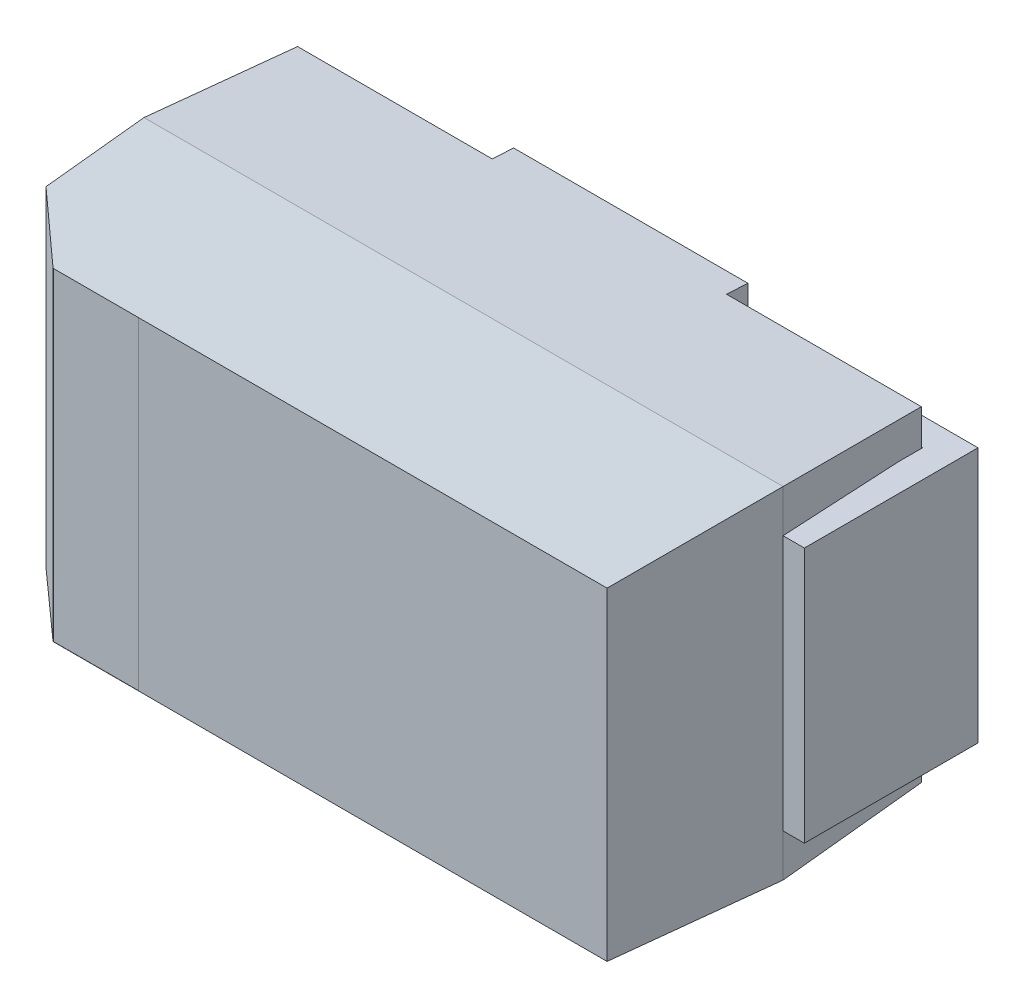
ISO-10303-21;
HEADER;
FILE_DESCRIPTION(('STEP AP214'),'2;1');
FILE_NAME('part.step','',(''),(''),'','','');
FILE_SCHEMA(('AUTOMOTIVE_DESIGN { 1 0 10303 214 1 1 1 1 }'));
ENDSEC;
DATA;
#1=APPLICATION_CONTEXT('core data for automotive mechanical design processes');
#2=APPLICATION_PROTOCOL_DEFINITION('international standard','automotive_design',2000,#1);
#3=PRODUCT_CONTEXT('',#1,'mechanical');
#4=PRODUCT('Part','Part','',(#3));
#5=PRODUCT_RELATED_PRODUCT_CATEGORY('part','',(#4));
#6=PRODUCT_DEFINITION_FORMATION('','',#4);
#7=PRODUCT_DEFINITION_CONTEXT('part definition',#1,'design');
#8=PRODUCT_DEFINITION('design','',#6,#7);
#9=PRODUCT_DEFINITION_SHAPE('','',#8);
#10=(LENGTH_UNIT() NAMED_UNIT(*) SI_UNIT(.MILLI.,.METRE.));
#11=(NAMED_UNIT(*) PLANE_ANGLE_UNIT() SI_UNIT($,.RADIAN.));
#12=(NAMED_UNIT(*) SI_UNIT($,.STERADIAN.) SOLID_ANGLE_UNIT());
#13=UNCERTAINTY_MEASURE_WITH_UNIT(LENGTH_MEASURE(1.E-05),#10,'distance_accuracy_value','');
#14=(GEOMETRIC_REPRESENTATION_CONTEXT(3) GLOBAL_UNCERTAINTY_ASSIGNED_CONTEXT((#13)) GLOBAL_UNIT_ASSIGNED_CONTEXT((#10,
#11,#12)) REPRESENTATION_CONTEXT('',''));
#15=CARTESIAN_POINT('',(0.,0.,0.));
#16=DIRECTION('',(0.,0.,1.));
#17=DIRECTION('',(1.,0.,0.));
#18=AXIS2_PLACEMENT_3D('',#15,#16,#17);
#19=CARTESIAN_POINT('',(-1.5,0.,0.815));
#20=DIRECTION('',(-0.998629534754574,0.,-0.0523359562429439));
#21=DIRECTION('',(-0.052335956242944,0.,0.998629534754574));
#22=AXIS2_PLACEMENT_3D('',#19,#20,#21);
#23=PLANE('',#22);
#24=DIRECTION('',(0.,-1.,0.));
#25=VECTOR('',#24,1.);
#26=CARTESIAN_POINT('',(-1.47,0.,0.242565899368158));
#27=LINE('',#26,#25);
#28=CARTESIAN_POINT('',(-1.47,0.6,0.242565899368157));
#29=VERTEX_POINT('',#28);
#30=CARTESIAN_POINT('',(-1.47,-0.6,0.242565899368157));
#31=VERTEX_POINT('',#30);
#32=EDGE_CURVE('E11',#29,#31,#27,.T.);
#33=ORIENTED_EDGE('',*,*,#32,.F.);
#34=DIRECTION('',(-0.052335956242944,0.,0.998629534754574));
#35=VECTOR('',#34,1.);
#36=CARTESIAN_POINT('',(-1.5,0.6,0.815));
#37=LINE('',#36,#35);
#38=CARTESIAN_POINT('',(-1.5,0.6,0.815));
#39=VERTEX_POINT('',#38);
#40=EDGE_CURVE('E317',#29,#39,#37,.T.);
#41=ORIENTED_EDGE('',*,*,#40,.T.);
#42=DIRECTION('',(0.,1.,0.));
#43=VECTOR('',#42,1.);
#44=CARTESIAN_POINT('',(-1.5,0.,0.815));
#45=LINE('',#44,#43);
#46=CARTESIAN_POINT('',(-1.5,0.8,0.815));
#47=VERTEX_POINT('',#46);
#48=EDGE_CURVE('E440',#47,#39,#45,.F.);
#49=ORIENTED_EDGE('',*,*,#48,.F.);
#50=DIRECTION('',(-0.052264427688714,0.052264427688714,0.997264688634237));
#51=VECTOR('',#50,1.);
#52=CARTESIAN_POINT('',(-1.49590264439756,0.795902644397557,0.736817797691552));
#53=LINE('',#52,#51);
#54=CARTESIAN_POINT('',(-1.46410067119112,0.764100671191117,0.13));
#55=VERTEX_POINT('',#54);
#56=EDGE_CURVE('E428',#55,#47,#53,.T.);
#57=ORIENTED_EDGE('',*,*,#56,.F.);
#58=DIRECTION('',(0.,-1.,0.));
#59=VECTOR('',#58,1.);
#60=CARTESIAN_POINT('',(-1.46410067119112,0.,0.13));
#61=LINE('',#60,#59);
#62=CARTESIAN_POINT('',(-1.46410067119112,0.6,0.13));
#63=VERTEX_POINT('',#62);
#64=EDGE_CURVE('E380',#55,#63,#61,.T.);
#65=ORIENTED_EDGE('',*,*,#64,.T.);
#66=CARTESIAN_POINT('',(-1.46410067119112,-0.6,0.13));
#67=VERTEX_POINT('',#66);
#68=EDGE_CURVE('E384',#63,#67,#61,.T.);
#69=ORIENTED_EDGE('',*,*,#68,.T.);
#70=CARTESIAN_POINT('',(-1.46410067119112,-0.764100671191117,0.13));
#71=VERTEX_POINT('',#70);
#72=EDGE_CURVE('E379',#67,#71,#61,.T.);
#73=ORIENTED_EDGE('',*,*,#72,.T.);
#74=DIRECTION('',(-0.052264427688714,-0.052264427688714,0.997264688634237));
#75=VECTOR('',#74,1.);
#76=CARTESIAN_POINT('',(-1.4978147436787,-0.797814743678697,0.773302825435494));
#77=LINE('',#76,#75);
#78=CARTESIAN_POINT('',(-1.5,-0.8,0.815));
#79=VERTEX_POINT('',#78);
#80=EDGE_CURVE('E430',#71,#79,#77,.T.);
#81=ORIENTED_EDGE('',*,*,#80,.T.);
#82=CARTESIAN_POINT('',(-1.5,-0.6,0.815));
#83=VERTEX_POINT('',#82);
#84=EDGE_CURVE('E444',#83,#79,#45,.F.);
#85=ORIENTED_EDGE('',*,*,#84,.F.);
#86=DIRECTION('',(-0.052335956242944,0.,0.998629534754574));
#87=VECTOR('',#86,1.);
#88=CARTESIAN_POINT('',(-1.5,-0.6,0.815));
#89=LINE('',#88,#87);
#90=EDGE_CURVE('E315',#31,#83,#89,.T.);
#91=ORIENTED_EDGE('',*,*,#90,.F.);
#92=EDGE_LOOP('',(#33,#41,#49,#57,#65,#69,#73,#81,#85,#91));
#93=FACE_BOUND('',#92,.T.);
#94=ADVANCED_FACE('F39',(#93),#23,.T.);
#95=CARTESIAN_POINT('',(0.,0.,0.13));
#96=DIRECTION('',(0.,0.,-1.));
#97=DIRECTION('',(1.,0.,0.));
#98=AXIS2_PLACEMENT_3D('',#95,#96,#97);
#99=PLANE('',#98);
#100=DIRECTION('',(0.,-1.,0.));
#101=VECTOR('',#100,1.);
#102=CARTESIAN_POINT('',(-0.6,0.6,0.13));
#103=LINE('',#102,#101);
#104=CARTESIAN_POINT('',(-0.6,0.6,0.13));
#105=VERTEX_POINT('',#104);
#106=CARTESIAN_POINT('',(-0.6,-0.6,0.13));
#107=VERTEX_POINT('',#106);
#108=EDGE_CURVE('E62',#105,#107,#103,.T.);
#109=ORIENTED_EDGE('',*,*,#108,.F.);
#110=DIRECTION('',(-1.,0.,0.));
#111=VECTOR('',#110,1.);
#112=CARTESIAN_POINT('',(-1.47,0.6,0.13));
#113=LINE('',#112,#111);
#114=EDGE_CURVE('E272',#105,#63,#113,.T.);
#115=ORIENTED_EDGE('',*,*,#114,.T.);
#116=ORIENTED_EDGE('',*,*,#64,.F.);
#117=DIRECTION('',(-1.,0.,0.));
#118=VECTOR('',#117,1.);
#119=CARTESIAN_POINT('',(0.,0.764100671191117,0.13));
#120=LINE('',#119,#118);
#121=CARTESIAN_POINT('',(-0.55,0.764100671191117,0.13));
#122=VERTEX_POINT('',#121);
#123=EDGE_CURVE('E474',#122,#55,#120,.T.);
#124=ORIENTED_EDGE('',*,*,#123,.F.);
#125=DIRECTION('',(0.,1.,0.));
#126=VECTOR('',#125,1.);
#127=CARTESIAN_POINT('',(-0.55,0.834389467592597,0.13));
#128=LINE('',#127,#126);
#129=CARTESIAN_POINT('',(-0.55,-0.764100671191117,0.13));
#130=VERTEX_POINT('',#129);
#131=EDGE_CURVE('E370',#130,#122,#128,.T.);
#132=ORIENTED_EDGE('',*,*,#131,.F.);
#133=DIRECTION('',(1.,0.,0.));
#134=VECTOR('',#133,1.);
#135=CARTESIAN_POINT('',(0.,-0.764100671191117,0.13));
#136=LINE('',#135,#134);
#137=EDGE_CURVE('E383',#71,#130,#136,.T.);
#138=ORIENTED_EDGE('',*,*,#137,.F.);
#139=ORIENTED_EDGE('',*,*,#72,.F.);
#140=DIRECTION('',(-1.,0.,0.));
#141=VECTOR('',#140,1.);
#142=CARTESIAN_POINT('',(-1.47,-0.6,0.13));
#143=LINE('',#142,#141);
#144=EDGE_CURVE('E290',#107,#67,#143,.T.);
#145=ORIENTED_EDGE('',*,*,#144,.F.);
#146=EDGE_LOOP('',(#109,#115,#116,#124,#132,#138,#139,#145));
#147=FACE_BOUND('',#146,.T.);
#148=ADVANCED_FACE('F561',(#147),#99,.T.);
#149=CARTESIAN_POINT('',(1.5,0.,0.815));
#150=DIRECTION('',(0.998629534754574,0.,-0.0523359562429439));
#151=DIRECTION('',(-0.052335956242944,0.,-0.998629534754574));
#152=AXIS2_PLACEMENT_3D('',#149,#150,#151);
#153=PLANE('',#152);
#154=DIRECTION('',(0.,-1.,0.));
#155=VECTOR('',#154,1.);
#156=CARTESIAN_POINT('',(1.5,0.,0.815));
#157=LINE('',#156,#155);
#158=CARTESIAN_POINT('',(1.5,0.6,0.815));
#159=VERTEX_POINT('',#158);
#160=CARTESIAN_POINT('',(1.5,0.8,0.815));
#161=VERTEX_POINT('',#160);
#162=EDGE_CURVE('E439',#159,#161,#157,.F.);
#163=ORIENTED_EDGE('',*,*,#162,.F.);
#164=DIRECTION('',(-0.052335956242944,0.,-0.998629534754574));
#165=VECTOR('',#164,1.);
#166=CARTESIAN_POINT('',(1.5,0.6,0.815));
#167=LINE('',#166,#165);
#168=CARTESIAN_POINT('',(1.47,0.6,0.242565899368157));
#169=VERTEX_POINT('',#168);
#170=EDGE_CURVE('E367',#159,#169,#167,.T.);
#171=ORIENTED_EDGE('',*,*,#170,.T.);
#172=DIRECTION('',(0.,-1.,0.));
#173=VECTOR('',#172,1.);
#174=CARTESIAN_POINT('',(1.47,0.,0.242565899368158));
#175=LINE('',#174,#173);
#176=CARTESIAN_POINT('',(1.47,-0.6,0.242565899368157));
#177=VERTEX_POINT('',#176);
#178=EDGE_CURVE('E47',#169,#177,#175,.T.);
#179=ORIENTED_EDGE('',*,*,#178,.T.);
#180=DIRECTION('',(-0.052335956242944,0.,-0.998629534754574));
#181=VECTOR('',#180,1.);
#182=CARTESIAN_POINT('',(1.5,-0.6,0.815));
#183=LINE('',#182,#181);
#184=CARTESIAN_POINT('',(1.5,-0.6,0.815));
#185=VERTEX_POINT('',#184);
#186=EDGE_CURVE('E365',#185,#177,#183,.T.);
#187=ORIENTED_EDGE('',*,*,#186,.F.);
#188=CARTESIAN_POINT('',(1.5,-0.8,0.815));
#189=VERTEX_POINT('',#188);
#190=EDGE_CURVE('E447',#189,#185,#157,.F.);
#191=ORIENTED_EDGE('',*,*,#190,.F.);
#192=DIRECTION('',(0.052264427688714,-0.052264427688714,0.997264688634237));
#193=VECTOR('',#192,1.);
#194=CARTESIAN_POINT('',(1.49590264439756,-0.795902644397557,0.736817797691552));
#195=LINE('',#194,#193);
#196=CARTESIAN_POINT('',(1.46410067119112,-0.764100671191117,0.13));
#197=VERTEX_POINT('',#196);
#198=EDGE_CURVE('E434',#197,#189,#195,.T.);
#199=ORIENTED_EDGE('',*,*,#198,.F.);
#200=DIRECTION('',(0.,1.,0.));
#201=VECTOR('',#200,1.);
#202=CARTESIAN_POINT('',(1.46410067119112,0.,0.13));
#203=LINE('',#202,#201);
#204=CARTESIAN_POINT('',(1.46410067119112,-0.6,0.13));
#205=VERTEX_POINT('',#204);
#206=EDGE_CURVE('E396',#197,#205,#203,.T.);
#207=ORIENTED_EDGE('',*,*,#206,.T.);
#208=CARTESIAN_POINT('',(1.46410067119112,0.6,0.13));
#209=VERTEX_POINT('',#208);
#210=EDGE_CURVE('E400',#205,#209,#203,.T.);
#211=ORIENTED_EDGE('',*,*,#210,.T.);
#212=CARTESIAN_POINT('',(1.46410067119112,0.764100671191117,0.13));
#213=VERTEX_POINT('',#212);
#214=EDGE_CURVE('E395',#209,#213,#203,.T.);
#215=ORIENTED_EDGE('',*,*,#214,.T.);
#216=DIRECTION('',(0.052264427688714,0.052264427688714,0.997264688634237));
#217=VECTOR('',#216,1.);
#218=CARTESIAN_POINT('',(1.4978147436787,0.797814743678697,0.773302825435494));
#219=LINE('',#218,#217);
#220=EDGE_CURVE('E431',#213,#161,#219,.T.);
#221=ORIENTED_EDGE('',*,*,#220,.T.);
#222=EDGE_LOOP('',(#163,#171,#179,#187,#191,#199,#207,#211,#215,#221));
#223=FACE_BOUND('',#222,.T.);
#224=ADVANCED_FACE('F480',(#223),#153,.T.);
#225=CARTESIAN_POINT('',(0.,0.,0.13));
#226=DIRECTION('',(0.,0.,-1.));
#227=DIRECTION('',(-1.,0.,0.));
#228=AXIS2_PLACEMENT_3D('',#225,#226,#227);
#229=PLANE('',#228);
#230=ORIENTED_EDGE('',*,*,#214,.F.);
#231=DIRECTION('',(1.,0.,0.));
#232=VECTOR('',#231,1.);
#233=CARTESIAN_POINT('',(1.47,0.6,0.13));
#234=LINE('',#233,#232);
#235=CARTESIAN_POINT('',(0.6,0.6,0.13));
#236=VERTEX_POINT('',#235);
#237=EDGE_CURVE('E321',#236,#209,#234,.T.);
#238=ORIENTED_EDGE('',*,*,#237,.F.);
#239=DIRECTION('',(0.,-1.,0.));
#240=VECTOR('',#239,1.);
#241=CARTESIAN_POINT('',(0.6,0.6,0.13));
#242=LINE('',#241,#240);
#243=CARTESIAN_POINT('',(0.6,-0.6,0.13));
#244=VERTEX_POINT('',#243);
#245=EDGE_CURVE('E337',#236,#244,#242,.T.);
#246=ORIENTED_EDGE('',*,*,#245,.T.);
#247=DIRECTION('',(1.,0.,0.));
#248=VECTOR('',#247,1.);
#249=CARTESIAN_POINT('',(1.47,-0.6,0.13));
#250=LINE('',#249,#248);
#251=EDGE_CURVE('E338',#244,#205,#250,.T.);
#252=ORIENTED_EDGE('',*,*,#251,.T.);
#253=ORIENTED_EDGE('',*,*,#206,.F.);
#254=DIRECTION('',(1.,0.,0.));
#255=VECTOR('',#254,1.);
#256=CARTESIAN_POINT('',(0.,-0.764100671191117,0.13));
#257=LINE('',#256,#255);
#258=CARTESIAN_POINT('',(0.55,-0.764100671191117,0.13));
#259=VERTEX_POINT('',#258);
#260=EDGE_CURVE('E399',#259,#197,#257,.T.);
#261=ORIENTED_EDGE('',*,*,#260,.F.);
#262=DIRECTION('',(0.,1.,0.));
#263=VECTOR('',#262,1.);
#264=CARTESIAN_POINT('',(0.55,0.834389467592597,0.13));
#265=LINE('',#264,#263);
#266=CARTESIAN_POINT('',(0.55,0.764100671191117,0.13));
#267=VERTEX_POINT('',#266);
#268=EDGE_CURVE('E387',#259,#267,#265,.T.);
#269=ORIENTED_EDGE('',*,*,#268,.T.);
#270=DIRECTION('',(-1.,0.,0.));
#271=VECTOR('',#270,1.);
#272=CARTESIAN_POINT('',(0.,0.764100671191117,0.13));
#273=LINE('',#272,#271);
#274=EDGE_CURVE('E468',#213,#267,#273,.T.);
#275=ORIENTED_EDGE('',*,*,#274,.F.);
#276=EDGE_LOOP('',(#230,#238,#246,#252,#253,#261,#269,#275));
#277=FACE_BOUND('',#276,.T.);
#278=ADVANCED_FACE('F520',(#277),#229,.T.);
#279=CARTESIAN_POINT('',(0.,-0.8,0.815));
#280=DIRECTION('',(0.,-0.998629534754574,-0.0523359562429439));
#281=DIRECTION('',(0.,0.052335956242944,-0.998629534754574));
#282=AXIS2_PLACEMENT_3D('',#279,#280,#281);
#283=PLANE('',#282);
#284=ORIENTED_EDGE('',*,*,#137,.T.);
#285=DIRECTION('',(0.,0.052335956242944,-0.998629534754574));
#286=VECTOR('',#285,1.);
#287=CARTESIAN_POINT('',(-0.55,-0.8,0.815));
#288=LINE('',#287,#286);
#289=CARTESIAN_POINT('',(-0.55,-0.758859893262813,0.03));
#290=VERTEX_POINT('',#289);
#291=EDGE_CURVE('E376',#130,#290,#288,.T.);
#292=ORIENTED_EDGE('',*,*,#291,.T.);
#293=DIRECTION('',(1.,0.,0.));
#294=VECTOR('',#293,1.);
#295=CARTESIAN_POINT('',(0.,-0.758859893262813,0.03));
#296=LINE('',#295,#294);
#297=CARTESIAN_POINT('',(0.55,-0.758859893262813,0.03));
#298=VERTEX_POINT('',#297);
#299=EDGE_CURVE('E403',#290,#298,#296,.T.);
#300=ORIENTED_EDGE('',*,*,#299,.T.);
#301=DIRECTION('',(0.,0.052335956242944,-0.998629534754574));
#302=VECTOR('',#301,1.);
#303=CARTESIAN_POINT('',(0.55,-0.8,0.815));
#304=LINE('',#303,#302);
#305=EDGE_CURVE('E392',#259,#298,#304,.T.);
#306=ORIENTED_EDGE('',*,*,#305,.F.);
#307=ORIENTED_EDGE('',*,*,#260,.T.);
#308=ORIENTED_EDGE('',*,*,#198,.T.);
#309=DIRECTION('',(-1.,0.,0.));
#310=VECTOR('',#309,1.);
#311=CARTESIAN_POINT('',(0.,-0.8,0.815));
#312=LINE('',#311,#310);
#313=EDGE_CURVE('E425',#79,#189,#312,.F.);
#314=ORIENTED_EDGE('',*,*,#313,.F.);
#315=ORIENTED_EDGE('',*,*,#80,.F.);
#316=EDGE_LOOP('',(#284,#292,#300,#306,#307,#308,#314,#315));
#317=FACE_BOUND('',#316,.T.);
#318=ADVANCED_FACE('F527',(#317),#283,.T.);
#319=CARTESIAN_POINT('',(0.,0.8,0.815));
#320=DIRECTION('',(0.,0.998629534754574,-0.0523359562429439));
#321=DIRECTION('',(0.,0.052335956242944,0.998629534754574));
#322=AXIS2_PLACEMENT_3D('',#319,#320,#321);
#323=PLANE('',#322);
#324=DIRECTION('',(-1.,0.,0.));
#325=VECTOR('',#324,1.);
#326=CARTESIAN_POINT('',(0.,0.758859893262813,0.03));
#327=LINE('',#326,#325);
#328=CARTESIAN_POINT('',(0.55,0.758859893262813,0.03));
#329=VERTEX_POINT('',#328);
#330=CARTESIAN_POINT('',(-0.55,0.758859893262813,0.03));
#331=VERTEX_POINT('',#330);
#332=EDGE_CURVE('E437',#329,#331,#327,.T.);
#333=ORIENTED_EDGE('',*,*,#332,.T.);
#334=DIRECTION('',(0.,0.052335956242944,0.998629534754574));
#335=VECTOR('',#334,1.);
#336=CARTESIAN_POINT('',(-0.55,0.8,0.815));
#337=LINE('',#336,#335);
#338=EDGE_CURVE('E373',#331,#122,#337,.T.);
#339=ORIENTED_EDGE('',*,*,#338,.T.);
#340=ORIENTED_EDGE('',*,*,#123,.T.);
#341=ORIENTED_EDGE('',*,*,#56,.T.);
#342=DIRECTION('',(1.,0.,0.));
#343=VECTOR('',#342,1.);
#344=CARTESIAN_POINT('',(0.,0.8,0.815));
#345=LINE('',#344,#343);
#346=EDGE_CURVE('E450',#161,#47,#345,.F.);
#347=ORIENTED_EDGE('',*,*,#346,.F.);
#348=ORIENTED_EDGE('',*,*,#220,.F.);
#349=ORIENTED_EDGE('',*,*,#274,.T.);
#350=DIRECTION('',(0.,0.052335956242944,0.998629534754574));
#351=VECTOR('',#350,1.);
#352=CARTESIAN_POINT('',(0.55,0.8,0.815));
#353=LINE('',#352,#351);
#354=EDGE_CURVE('E390',#329,#267,#353,.T.);
#355=ORIENTED_EDGE('',*,*,#354,.F.);
#356=EDGE_LOOP('',(#333,#339,#340,#341,#347,#348,#349,#355));
#357=FACE_BOUND('',#356,.T.);
#358=ADVANCED_FACE('F538',(#357),#323,.T.);
#359=CARTESIAN_POINT('',(0.,0.,0.03));
#360=DIRECTION('',(0.,0.,-1.));
#361=DIRECTION('',(1.,0.,0.));
#362=AXIS2_PLACEMENT_3D('',#359,#360,#361);
#363=PLANE('',#362);
#364=ORIENTED_EDGE('',*,*,#299,.F.);
#365=DIRECTION('',(0.,1.,0.));
#366=VECTOR('',#365,1.);
#367=CARTESIAN_POINT('',(-0.55,0.,0.03));
#368=LINE('',#367,#366);
#369=EDGE_CURVE('E471',#290,#331,#368,.T.);
#370=ORIENTED_EDGE('',*,*,#369,.T.);
#371=ORIENTED_EDGE('',*,*,#332,.F.);
#372=DIRECTION('',(0.,1.,0.));
#373=VECTOR('',#372,1.);
#374=CARTESIAN_POINT('',(0.55,0.,0.03));
#375=LINE('',#374,#373);
#376=EDGE_CURVE('E466',#298,#329,#375,.T.);
#377=ORIENTED_EDGE('',*,*,#376,.F.);
#378=EDGE_LOOP('',(#364,#370,#371,#377));
#379=FACE_BOUND('',#378,.T.);
#380=ADVANCED_FACE('F536',(#379),#363,.T.);
#381=CARTESIAN_POINT('',(1.5,0.,0.815));
#382=DIRECTION('',(0.998629534754574,0.,0.0523359562429439));
#383=DIRECTION('',(0.052335956242944,0.,-0.998629534754574));
#384=AXIS2_PLACEMENT_3D('',#381,#382,#383);
#385=PLANE('',#384);
#386=ORIENTED_EDGE('',*,*,#190,.T.);
#387=EDGE_CURVE('E451',#185,#159,#157,.F.);
#388=ORIENTED_EDGE('',*,*,#387,.T.);
#389=ORIENTED_EDGE('',*,*,#162,.T.);
#390=DIRECTION('',(0.052264427688714,0.052264427688714,-0.997264688634237));
#391=VECTOR('',#390,1.);
#392=CARTESIAN_POINT('',(1.49590264439756,0.795902644397557,0.893182202308448));
#393=LINE('',#392,#391);
#394=CARTESIAN_POINT('',(1.45885989326281,0.758859893262813,1.6));
#395=VERTEX_POINT('',#394);
#396=EDGE_CURVE('E411',#395,#161,#393,.T.);
#397=ORIENTED_EDGE('',*,*,#396,.F.);
#398=DIRECTION('',(0.,-1.,0.));
#399=VECTOR('',#398,1.);
#400=CARTESIAN_POINT('',(1.45885989326281,0.,1.6));
#401=LINE('',#400,#399);
#402=CARTESIAN_POINT('',(1.45885989326281,-0.758859893262813,1.6));
#403=VERTEX_POINT('',#402);
#404=EDGE_CURVE('E421',#403,#395,#401,.F.);
#405=ORIENTED_EDGE('',*,*,#404,.F.);
#406=DIRECTION('',(0.052264427688714,-0.052264427688714,-0.997264688634237));
#407=VECTOR('',#406,1.);
#408=CARTESIAN_POINT('',(1.4978147436787,-0.797814743678697,0.856697174564506));
#409=LINE('',#408,#407);
#410=EDGE_CURVE('E408',#403,#189,#409,.T.);
#411=ORIENTED_EDGE('',*,*,#410,.T.);
#412=EDGE_LOOP('',(#386,#388,#389,#397,#405,#411));
#413=FACE_BOUND('',#412,.T.);
#414=ADVANCED_FACE('F542',(#413),#385,.T.);
#415=CARTESIAN_POINT('',(0.,0.8,0.815));
#416=DIRECTION('',(0.,0.998629534754574,0.0523359562429439));
#417=DIRECTION('',(0.,-0.052335956242944,0.998629534754574));
#418=AXIS2_PLACEMENT_3D('',#415,#416,#417);
#419=PLANE('',#418);
#420=DIRECTION('',(-0.052264427688714,0.052264427688714,-0.997264688634237));
#421=VECTOR('',#420,1.);
#422=CARTESIAN_POINT('',(-1.4978147436787,0.797814743678697,0.856697174564506));
#423=LINE('',#422,#421);
#424=CARTESIAN_POINT('',(-1.4745606801357,0.774560680135696,1.30041113957363));
#425=VERTEX_POINT('',#424);
#426=EDGE_CURVE('E407',#425,#47,#423,.T.);
#427=ORIENTED_EDGE('',*,*,#426,.F.);
#428=DIRECTION('',(0.742688309017099,-0.0350461069503161,0.668719557091722));
#429=VECTOR('',#428,1.);
#430=CARTESIAN_POINT('',(-1.12208168375109,0.757927839070265,1.61778465344837));
#431=LINE('',#430,#429);
#432=CARTESIAN_POINT('',(-1.14183354244275,0.758859893262813,1.6));
#433=VERTEX_POINT('',#432);
#434=EDGE_CURVE('E463',#425,#433,#431,.T.);
#435=ORIENTED_EDGE('',*,*,#434,.T.);
#436=DIRECTION('',(-1.,0.,0.));
#437=VECTOR('',#436,1.);
#438=CARTESIAN_POINT('',(-0.741833542442751,0.758859893262813,1.6));
#439=LINE('',#438,#437);
#440=CARTESIAN_POINT('',(-0.741833542442751,0.758859893262813,1.6));
#441=VERTEX_POINT('',#440);
#442=EDGE_CURVE('E259',#441,#433,#439,.T.);
#443=ORIENTED_EDGE('',*,*,#442,.F.);
#444=DIRECTION('',(1.,0.,0.));
#445=VECTOR('',#444,1.);
#446=CARTESIAN_POINT('',(0.,0.758859893262813,1.6));
#447=LINE('',#446,#445);
#448=EDGE_CURVE('E424',#395,#441,#447,.F.);
#449=ORIENTED_EDGE('',*,*,#448,.F.);
#450=ORIENTED_EDGE('',*,*,#396,.T.);
#451=ORIENTED_EDGE('',*,*,#346,.T.);
#452=EDGE_LOOP('',(#427,#435,#443,#449,#450,#451));
#453=FACE_BOUND('',#452,.T.);
#454=ADVANCED_FACE('F601',(#453),#419,.T.);
#455=CARTESIAN_POINT('',(-1.5,0.,0.815));
#456=DIRECTION('',(-0.998629534754574,0.,0.0523359562429439));
#457=DIRECTION('',(0.052335956242944,0.,0.998629534754574));
#458=AXIS2_PLACEMENT_3D('',#455,#456,#457);
#459=PLANE('',#458);
#460=DIRECTION('',(-0.052264427688714,-0.052264427688714,-0.997264688634237));
#461=VECTOR('',#460,1.);
#462=CARTESIAN_POINT('',(-1.49590264439756,-0.795902644397557,0.893182202308448));
#463=LINE('',#462,#461);
#464=CARTESIAN_POINT('',(-1.4745606801357,-0.774560680135696,1.30041113957363));
#465=VERTEX_POINT('',#464);
#466=EDGE_CURVE('E404',#465,#79,#463,.T.);
#467=ORIENTED_EDGE('',*,*,#466,.F.);
#468=DIRECTION('',(0.,-1.,0.));
#469=VECTOR('',#468,1.);
#470=CARTESIAN_POINT('',(-1.4745606801357,0.758859893262813,1.30041113957363));
#471=LINE('',#470,#469);
#472=EDGE_CURVE('E461',#465,#425,#471,.F.);
#473=ORIENTED_EDGE('',*,*,#472,.T.);
#474=ORIENTED_EDGE('',*,*,#426,.T.);
#475=ORIENTED_EDGE('',*,*,#48,.T.);
#476=EDGE_CURVE('E443',#39,#83,#45,.F.);
#477=ORIENTED_EDGE('',*,*,#476,.T.);
#478=ORIENTED_EDGE('',*,*,#84,.T.);
#479=EDGE_LOOP('',(#467,#473,#474,#475,#477,#478));
#480=FACE_BOUND('',#479,.T.);
#481=ADVANCED_FACE('F598',(#480),#459,.T.);
#482=CARTESIAN_POINT('',(0.,-0.8,0.815));
#483=DIRECTION('',(0.,-0.998629534754574,0.0523359562429439));
#484=DIRECTION('',(0.,-0.052335956242944,-0.998629534754574));
#485=AXIS2_PLACEMENT_3D('',#482,#483,#484);
#486=PLANE('',#485);
#487=DIRECTION('',(-1.,0.,0.));
#488=VECTOR('',#487,1.);
#489=CARTESIAN_POINT('',(0.,-0.758859893262813,1.6));
#490=LINE('',#489,#488);
#491=CARTESIAN_POINT('',(-1.14183354244275,-0.758859893262813,1.6));
#492=VERTEX_POINT('',#491);
#493=CARTESIAN_POINT('',(-0.74183354244275,-0.758859893262813,1.6));
#494=VERTEX_POINT('',#493);
#495=EDGE_CURVE('E417',#492,#494,#490,.F.);
#496=ORIENTED_EDGE('',*,*,#495,.F.);
#497=DIRECTION('',(-0.742688309017099,-0.0350461069503161,-0.668719557091722));
#498=VECTOR('',#497,1.);
#499=CARTESIAN_POINT('',(-1.12208168375109,-0.757927839070265,1.61778465344837));
#500=LINE('',#499,#498);
#501=EDGE_CURVE('E459',#492,#465,#500,.T.);
#502=ORIENTED_EDGE('',*,*,#501,.T.);
#503=ORIENTED_EDGE('',*,*,#466,.T.);
#504=ORIENTED_EDGE('',*,*,#313,.T.);
#505=ORIENTED_EDGE('',*,*,#410,.F.);
#506=EDGE_CURVE('E420',#494,#403,#490,.F.);
#507=ORIENTED_EDGE('',*,*,#506,.F.);
#508=EDGE_LOOP('',(#496,#502,#503,#504,#505,#507));
#509=FACE_BOUND('',#508,.T.);
#510=ADVANCED_FACE('F547',(#509),#486,.T.);
#511=CARTESIAN_POINT('',(0.,0.,1.6));
#512=DIRECTION('',(0.,0.,1.));
#513=DIRECTION('',(1.,0.,0.));
#514=AXIS2_PLACEMENT_3D('',#511,#512,#513);
#515=PLANE('',#514);
#516=DIRECTION('',(0.,1.,0.));
#517=VECTOR('',#516,1.);
#518=CARTESIAN_POINT('',(-0.741833542442751,0.758859893262813,1.6));
#519=LINE('',#518,#517);
#520=EDGE_CURVE('E242',#494,#441,#519,.T.);
#521=ORIENTED_EDGE('',*,*,#520,.F.);
#522=ORIENTED_EDGE('',*,*,#506,.T.);
#523=ORIENTED_EDGE('',*,*,#404,.T.);
#524=ORIENTED_EDGE('',*,*,#448,.T.);
#525=EDGE_LOOP('',(#521,#522,#523,#524));
#526=FACE_BOUND('',#525,.T.);
#527=ADVANCED_FACE('F594',(#526),#515,.T.);
#528=CARTESIAN_POINT('',(-1.14183354244275,0.,1.6));
#529=DIRECTION('',(0.669130606358859,0.,-0.743144825477393));
#530=DIRECTION('',(0.,-1.,0.));
#531=AXIS2_PLACEMENT_3D('',#528,#529,#530);
#532=PLANE('',#531);
#533=ORIENTED_EDGE('',*,*,#434,.F.);
#534=ORIENTED_EDGE('',*,*,#472,.F.);
#535=ORIENTED_EDGE('',*,*,#501,.F.);
#536=DIRECTION('',(0.,-1.,0.));
#537=VECTOR('',#536,1.);
#538=CARTESIAN_POINT('',(-1.14183354244275,-0.758859893262813,1.6));
#539=LINE('',#538,#537);
#540=EDGE_CURVE('E414',#433,#492,#539,.T.);
#541=ORIENTED_EDGE('',*,*,#540,.F.);
#542=EDGE_LOOP('',(#533,#534,#535,#541));
#543=FACE_BOUND('',#542,.T.);
#544=ADVANCED_FACE('F41',(#543),#532,.F.);
#545=CARTESIAN_POINT('',(0.55,0.834389467592597,0.13));
#546=DIRECTION('',(-1.,0.,0.));
#547=DIRECTION('',(0.,-1.,0.));
#548=AXIS2_PLACEMENT_3D('',#545,#546,#547);
#549=PLANE('',#548);
#550=ORIENTED_EDGE('',*,*,#305,.T.);
#551=ORIENTED_EDGE('',*,*,#376,.T.);
#552=ORIENTED_EDGE('',*,*,#354,.T.);
#553=ORIENTED_EDGE('',*,*,#268,.F.);
#554=EDGE_LOOP('',(#550,#551,#552,#553));
#555=FACE_BOUND('',#554,.T.);
#556=ADVANCED_FACE('F532',(#555),#549,.F.);
#557=CARTESIAN_POINT('',(-0.55,0.834389467592597,0.13));
#558=DIRECTION('',(-1.,0.,0.));
#559=DIRECTION('',(0.,-1.,0.));
#560=AXIS2_PLACEMENT_3D('',#557,#558,#559);
#561=PLANE('',#560);
#562=ORIENTED_EDGE('',*,*,#131,.T.);
#563=ORIENTED_EDGE('',*,*,#338,.F.);
#564=ORIENTED_EDGE('',*,*,#369,.F.);
#565=ORIENTED_EDGE('',*,*,#291,.F.);
#566=EDGE_LOOP('',(#562,#563,#564,#565));
#567=FACE_BOUND('',#566,.T.);
#568=ADVANCED_FACE('F563',(#567),#561,.T.);
#569=CARTESIAN_POINT('',(1.6,0.6,0.815));
#570=DIRECTION('',(0.,0.,-1.));
#571=DIRECTION('',(-1.,0.,0.));
#572=AXIS2_PLACEMENT_3D('',#569,#570,#571);
#573=PLANE('',#572);
#574=DIRECTION('',(1.,0.,0.));
#575=VECTOR('',#574,1.);
#576=CARTESIAN_POINT('',(1.6,0.6,0.815));
#577=LINE('',#576,#575);
#578=CARTESIAN_POINT('',(1.6,0.6,0.815));
#579=VERTEX_POINT('',#578);
#580=EDGE_CURVE('E328',#159,#579,#577,.T.);
#581=ORIENTED_EDGE('',*,*,#580,.F.);
#582=ORIENTED_EDGE('',*,*,#387,.F.);
#583=DIRECTION('',(1.,0.,0.));
#584=VECTOR('',#583,1.);
#585=CARTESIAN_POINT('',(1.6,-0.6,0.815));
#586=LINE('',#585,#584);
#587=CARTESIAN_POINT('',(1.6,-0.6,0.815));
#588=VERTEX_POINT('',#587);
#589=EDGE_CURVE('E343',#185,#588,#586,.T.);
#590=ORIENTED_EDGE('',*,*,#589,.T.);
#591=DIRECTION('',(0.,-1.,0.));
#592=VECTOR('',#591,1.);
#593=CARTESIAN_POINT('',(1.6,0.6,0.815));
#594=LINE('',#593,#592);
#595=EDGE_CURVE('E359',#579,#588,#594,.T.);
#596=ORIENTED_EDGE('',*,*,#595,.F.);
#597=EDGE_LOOP('',(#581,#582,#590,#596));
#598=FACE_BOUND('',#597,.T.);
#599=ADVANCED_FACE('F504',(#598),#573,.F.);
#600=CARTESIAN_POINT('',(1.47,0.6,0.13));
#601=DIRECTION('',(0.,0.,-1.));
#602=DIRECTION('',(-1.,0.,0.));
#603=AXIS2_PLACEMENT_3D('',#600,#601,#602);
#604=PLANE('',#603);
#605=ORIENTED_EDGE('',*,*,#210,.F.);
#606=CARTESIAN_POINT('',(1.47,-0.6,0.13));
#607=VERTEX_POINT('',#606);
#608=EDGE_CURVE('E320',#205,#607,#250,.T.);
#609=ORIENTED_EDGE('',*,*,#608,.T.);
#610=DIRECTION('',(0.,-1.,0.));
#611=VECTOR('',#610,1.);
#612=CARTESIAN_POINT('',(1.47,0.6,0.13));
#613=LINE('',#612,#611);
#614=CARTESIAN_POINT('',(1.47,0.6,0.13));
#615=VERTEX_POINT('',#614);
#616=EDGE_CURVE('E362',#615,#607,#613,.T.);
#617=ORIENTED_EDGE('',*,*,#616,.F.);
#618=EDGE_CURVE('E325',#209,#615,#234,.T.);
#619=ORIENTED_EDGE('',*,*,#618,.F.);
#620=EDGE_LOOP('',(#605,#609,#617,#619));
#621=FACE_BOUND('',#620,.T.);
#622=ADVANCED_FACE('F493',(#621),#604,.F.);
#623=CARTESIAN_POINT('',(1.47,0.6,0.815));
#624=DIRECTION('',(1.,0.,0.));
#625=DIRECTION('',(0.,0.,-1.));
#626=AXIS2_PLACEMENT_3D('',#623,#624,#625);
#627=PLANE('',#626);
#628=ORIENTED_EDGE('',*,*,#178,.F.);
#629=DIRECTION('',(0.,0.,1.));
#630=VECTOR('',#629,1.);
#631=CARTESIAN_POINT('',(1.47,0.6,0.815));
#632=LINE('',#631,#630);
#633=EDGE_CURVE('E324',#615,#169,#632,.T.);
#634=ORIENTED_EDGE('',*,*,#633,.F.);
#635=ORIENTED_EDGE('',*,*,#616,.T.);
#636=DIRECTION('',(0.,0.,1.));
#637=VECTOR('',#636,1.);
#638=CARTESIAN_POINT('',(1.47,-0.6,0.815));
#639=LINE('',#638,#637);
#640=EDGE_CURVE('E340',#607,#177,#639,.T.);
#641=ORIENTED_EDGE('',*,*,#640,.T.);
#642=EDGE_LOOP('',(#628,#634,#635,#641));
#643=FACE_BOUND('',#642,.T.);
#644=ADVANCED_FACE('F485',(#643),#627,.F.);
#645=CARTESIAN_POINT('',(1.6,0.6,0.));
#646=DIRECTION('',(-1.,0.,0.));
#647=DIRECTION('',(0.,0.,1.));
#648=AXIS2_PLACEMENT_3D('',#645,#646,#647);
#649=PLANE('',#648);
#650=DIRECTION('',(0.,0.,-1.));
#651=VECTOR('',#650,1.);
#652=CARTESIAN_POINT('',(1.6,-0.6,0.));
#653=LINE('',#652,#651);
#654=CARTESIAN_POINT('',(1.6,-0.6,0.));
#655=VERTEX_POINT('',#654);
#656=EDGE_CURVE('E345',#588,#655,#653,.T.);
#657=ORIENTED_EDGE('',*,*,#656,.T.);
#658=DIRECTION('',(0.,-1.,0.));
#659=VECTOR('',#658,1.);
#660=CARTESIAN_POINT('',(1.6,0.6,0.));
#661=LINE('',#660,#659);
#662=CARTESIAN_POINT('',(1.6,0.6,0.));
#663=VERTEX_POINT('',#662);
#664=EDGE_CURVE('E356',#663,#655,#661,.T.);
#665=ORIENTED_EDGE('',*,*,#664,.F.);
#666=DIRECTION('',(0.,0.,-1.));
#667=VECTOR('',#666,1.);
#668=CARTESIAN_POINT('',(1.6,0.6,0.));
#669=LINE('',#668,#667);
#670=EDGE_CURVE('E330',#579,#663,#669,.T.);
#671=ORIENTED_EDGE('',*,*,#670,.F.);
#672=ORIENTED_EDGE('',*,*,#595,.T.);
#673=EDGE_LOOP('',(#657,#665,#671,#672));
#674=FACE_BOUND('',#673,.T.);
#675=ADVANCED_FACE('F508',(#674),#649,.F.);
#676=CARTESIAN_POINT('',(0.6,0.6,0.));
#677=DIRECTION('',(0.,0.,1.));
#678=DIRECTION('',(1.,0.,0.));
#679=AXIS2_PLACEMENT_3D('',#676,#677,#678);
#680=PLANE('',#679);
#681=DIRECTION('',(-1.,0.,0.));
#682=VECTOR('',#681,1.);
#683=CARTESIAN_POINT('',(0.6,-0.6,0.));
#684=LINE('',#683,#682);
#685=CARTESIAN_POINT('',(0.6,-0.6,0.));
#686=VERTEX_POINT('',#685);
#687=EDGE_CURVE('E347',#655,#686,#684,.T.);
#688=ORIENTED_EDGE('',*,*,#687,.T.);
#689=DIRECTION('',(0.,-1.,0.));
#690=VECTOR('',#689,1.);
#691=CARTESIAN_POINT('',(0.6,0.6,0.));
#692=LINE('',#691,#690);
#693=CARTESIAN_POINT('',(0.6,0.6,0.));
#694=VERTEX_POINT('',#693);
#695=EDGE_CURVE('E353',#694,#686,#692,.T.);
#696=ORIENTED_EDGE('',*,*,#695,.F.);
#697=DIRECTION('',(-1.,0.,0.));
#698=VECTOR('',#697,1.);
#699=CARTESIAN_POINT('',(0.6,0.6,0.));
#700=LINE('',#699,#698);
#701=EDGE_CURVE('E332',#663,#694,#700,.T.);
#702=ORIENTED_EDGE('',*,*,#701,.F.);
#703=ORIENTED_EDGE('',*,*,#664,.T.);
#704=EDGE_LOOP('',(#688,#696,#702,#703));
#705=FACE_BOUND('',#704,.T.);
#706=ADVANCED_FACE('F515',(#705),#680,.F.);
#707=CARTESIAN_POINT('',(0.6,0.6,0.13));
#708=DIRECTION('',(1.,0.,0.));
#709=DIRECTION('',(0.,0.,-1.));
#710=AXIS2_PLACEMENT_3D('',#707,#708,#709);
#711=PLANE('',#710);
#712=DIRECTION('',(0.,0.,1.));
#713=VECTOR('',#712,1.);
#714=CARTESIAN_POINT('',(0.6,-0.6,0.13));
#715=LINE('',#714,#713);
#716=EDGE_CURVE('E349',#686,#244,#715,.T.);
#717=ORIENTED_EDGE('',*,*,#716,.T.);
#718=ORIENTED_EDGE('',*,*,#245,.F.);
#719=DIRECTION('',(0.,0.,1.));
#720=VECTOR('',#719,1.);
#721=CARTESIAN_POINT('',(0.6,0.6,0.13));
#722=LINE('',#721,#720);
#723=EDGE_CURVE('E334',#694,#236,#722,.T.);
#724=ORIENTED_EDGE('',*,*,#723,.F.);
#725=ORIENTED_EDGE('',*,*,#695,.T.);
#726=EDGE_LOOP('',(#717,#718,#724,#725));
#727=FACE_BOUND('',#726,.T.);
#728=ADVANCED_FACE('F518',(#727),#711,.F.);
#729=CARTESIAN_POINT('',(0.,0.6,0.));
#730=DIRECTION('',(0.,-1.,0.));
#731=DIRECTION('',(0.,0.,-1.));
#732=AXIS2_PLACEMENT_3D('',#729,#730,#731);
#733=PLANE('',#732);
#734=ORIENTED_EDGE('',*,*,#170,.F.);
#735=ORIENTED_EDGE('',*,*,#580,.T.);
#736=ORIENTED_EDGE('',*,*,#670,.T.);
#737=ORIENTED_EDGE('',*,*,#701,.T.);
#738=ORIENTED_EDGE('',*,*,#723,.T.);
#739=ORIENTED_EDGE('',*,*,#237,.T.);
#740=ORIENTED_EDGE('',*,*,#618,.T.);
#741=ORIENTED_EDGE('',*,*,#633,.T.);
#742=EDGE_LOOP('',(#734,#735,#736,#737,#738,#739,#740,#741));
#743=FACE_BOUND('',#742,.T.);
#744=ADVANCED_FACE('F489',(#743),#733,.F.);
#745=CARTESIAN_POINT('',(0.,-0.6,0.));
#746=DIRECTION('',(0.,-1.,0.));
#747=DIRECTION('',(0.,0.,-1.));
#748=AXIS2_PLACEMENT_3D('',#745,#746,#747);
#749=PLANE('',#748);
#750=ORIENTED_EDGE('',*,*,#589,.F.);
#751=ORIENTED_EDGE('',*,*,#186,.T.);
#752=ORIENTED_EDGE('',*,*,#640,.F.);
#753=ORIENTED_EDGE('',*,*,#608,.F.);
#754=ORIENTED_EDGE('',*,*,#251,.F.);
#755=ORIENTED_EDGE('',*,*,#716,.F.);
#756=ORIENTED_EDGE('',*,*,#687,.F.);
#757=ORIENTED_EDGE('',*,*,#656,.F.);
#758=EDGE_LOOP('',(#750,#751,#752,#753,#754,#755,#756,#757));
#759=FACE_BOUND('',#758,.T.);
#760=ADVANCED_FACE('F499',(#759),#749,.T.);
#761=CARTESIAN_POINT('',(-1.6,0.6,0.815));
#762=DIRECTION('',(0.,0.,1.));
#763=DIRECTION('',(1.,0.,0.));
#764=AXIS2_PLACEMENT_3D('',#761,#762,#763);
#765=PLANE('',#764);
#766=ORIENTED_EDGE('',*,*,#476,.F.);
#767=DIRECTION('',(-1.,0.,0.));
#768=VECTOR('',#767,1.);
#769=CARTESIAN_POINT('',(-1.6,0.6,0.815));
#770=LINE('',#769,#768);
#771=CARTESIAN_POINT('',(-1.6,0.6,0.815));
#772=VERTEX_POINT('',#771);
#773=EDGE_CURVE('E284',#39,#772,#770,.T.);
#774=ORIENTED_EDGE('',*,*,#773,.T.);
#775=DIRECTION('',(0.,-1.,0.));
#776=VECTOR('',#775,1.);
#777=CARTESIAN_POINT('',(-1.6,0.6,0.815));
#778=LINE('',#777,#776);
#779=CARTESIAN_POINT('',(-1.6,-0.6,0.815));
#780=VERTEX_POINT('',#779);
#781=EDGE_CURVE('E308',#772,#780,#778,.T.);
#782=ORIENTED_EDGE('',*,*,#781,.T.);
#783=DIRECTION('',(-1.,0.,0.));
#784=VECTOR('',#783,1.);
#785=CARTESIAN_POINT('',(-1.6,-0.6,0.815));
#786=LINE('',#785,#784);
#787=EDGE_CURVE('E54',#83,#780,#786,.T.);
#788=ORIENTED_EDGE('',*,*,#787,.F.);
#789=EDGE_LOOP('',(#766,#774,#782,#788));
#790=FACE_BOUND('',#789,.T.);
#791=ADVANCED_FACE('F690',(#790),#765,.T.);
#792=CARTESIAN_POINT('',(-1.47,0.6,0.13));
#793=DIRECTION('',(0.,0.,1.));
#794=DIRECTION('',(1.,0.,0.));
#795=AXIS2_PLACEMENT_3D('',#792,#793,#794);
#796=PLANE('',#795);
#797=CARTESIAN_POINT('',(-1.47,-0.6,0.13));
#798=VERTEX_POINT('',#797);
#799=EDGE_CURVE('E268',#67,#798,#143,.T.);
#800=ORIENTED_EDGE('',*,*,#799,.F.);
#801=ORIENTED_EDGE('',*,*,#68,.F.);
#802=CARTESIAN_POINT('',(-1.47,0.6,0.13));
#803=VERTEX_POINT('',#802);
#804=EDGE_CURVE('E275',#63,#803,#113,.T.);
#805=ORIENTED_EDGE('',*,*,#804,.T.);
#806=DIRECTION('',(0.,-1.,0.));
#807=VECTOR('',#806,1.);
#808=CARTESIAN_POINT('',(-1.47,0.6,0.13));
#809=LINE('',#808,#807);
#810=EDGE_CURVE('E289',#803,#798,#809,.T.);
#811=ORIENTED_EDGE('',*,*,#810,.T.);
#812=EDGE_LOOP('',(#800,#801,#805,#811));
#813=FACE_BOUND('',#812,.T.);
#814=ADVANCED_FACE('F748',(#813),#796,.T.);
#815=CARTESIAN_POINT('',(-0.6,0.6,0.13));
#816=DIRECTION('',(1.,0.,0.));
#817=DIRECTION('',(0.,0.,-1.));
#818=AXIS2_PLACEMENT_3D('',#815,#816,#817);
#819=PLANE('',#818);
#820=DIRECTION('',(0.,0.,1.));
#821=VECTOR('',#820,1.);
#822=CARTESIAN_POINT('',(-0.6,-0.6,0.13));
#823=LINE('',#822,#821);
#824=CARTESIAN_POINT('',(-0.6,-0.6,0.));
#825=VERTEX_POINT('',#824);
#826=EDGE_CURVE('E293',#825,#107,#823,.T.);
#827=ORIENTED_EDGE('',*,*,#826,.F.);
#828=DIRECTION('',(0.,-1.,0.));
#829=VECTOR('',#828,1.);
#830=CARTESIAN_POINT('',(-0.6,0.6,0.));
#831=LINE('',#830,#829);
#832=CARTESIAN_POINT('',(-0.6,0.6,0.));
#833=VERTEX_POINT('',#832);
#834=EDGE_CURVE('E312',#833,#825,#831,.T.);
#835=ORIENTED_EDGE('',*,*,#834,.F.);
#836=DIRECTION('',(0.,0.,1.));
#837=VECTOR('',#836,1.);
#838=CARTESIAN_POINT('',(-0.6,0.6,0.13));
#839=LINE('',#838,#837);
#840=EDGE_CURVE('E274',#833,#105,#839,.T.);
#841=ORIENTED_EDGE('',*,*,#840,.T.);
#842=ORIENTED_EDGE('',*,*,#108,.T.);
#843=EDGE_LOOP('',(#827,#835,#841,#842));
#844=FACE_BOUND('',#843,.T.);
#845=ADVANCED_FACE('F751',(#844),#819,.T.);
#846=CARTESIAN_POINT('',(-0.6,0.6,0.));
#847=DIRECTION('',(0.,0.,-1.));
#848=DIRECTION('',(-1.,0.,0.));
#849=AXIS2_PLACEMENT_3D('',#846,#847,#848);
#850=PLANE('',#849);
#851=DIRECTION('',(1.,0.,0.));
#852=VECTOR('',#851,1.);
#853=CARTESIAN_POINT('',(-0.6,-0.6,0.));
#854=LINE('',#853,#852);
#855=CARTESIAN_POINT('',(-1.6,-0.6,0.));
#856=VERTEX_POINT('',#855);
#857=EDGE_CURVE('E296',#856,#825,#854,.T.);
#858=ORIENTED_EDGE('',*,*,#857,.F.);
#859=DIRECTION('',(0.,-1.,0.));
#860=VECTOR('',#859,1.);
#861=CARTESIAN_POINT('',(-1.6,0.6,0.));
#862=LINE('',#861,#860);
#863=CARTESIAN_POINT('',(-1.6,0.6,0.));
#864=VERTEX_POINT('',#863);
#865=EDGE_CURVE('E310',#864,#856,#862,.T.);
#866=ORIENTED_EDGE('',*,*,#865,.F.);
#867=DIRECTION('',(1.,0.,0.));
#868=VECTOR('',#867,1.);
#869=CARTESIAN_POINT('',(-0.6,0.6,0.));
#870=LINE('',#869,#868);
#871=EDGE_CURVE('E278',#864,#833,#870,.T.);
#872=ORIENTED_EDGE('',*,*,#871,.T.);
#873=ORIENTED_EDGE('',*,*,#834,.T.);
#874=EDGE_LOOP('',(#858,#866,#872,#873));
#875=FACE_BOUND('',#874,.T.);
#876=ADVANCED_FACE('F755',(#875),#850,.T.);
#877=CARTESIAN_POINT('',(-1.6,0.6,0.));
#878=DIRECTION('',(-1.,0.,0.));
#879=DIRECTION('',(0.,0.,1.));
#880=AXIS2_PLACEMENT_3D('',#877,#878,#879);
#881=PLANE('',#880);
#882=DIRECTION('',(0.,0.,-1.));
#883=VECTOR('',#882,1.);
#884=CARTESIAN_POINT('',(-1.6,-0.6,0.));
#885=LINE('',#884,#883);
#886=EDGE_CURVE('E299',#780,#856,#885,.T.);
#887=ORIENTED_EDGE('',*,*,#886,.F.);
#888=ORIENTED_EDGE('',*,*,#781,.F.);
#889=DIRECTION('',(0.,0.,-1.));
#890=VECTOR('',#889,1.);
#891=CARTESIAN_POINT('',(-1.6,0.6,0.));
#892=LINE('',#891,#890);
#893=EDGE_CURVE('E281',#772,#864,#892,.T.);
#894=ORIENTED_EDGE('',*,*,#893,.T.);
#895=ORIENTED_EDGE('',*,*,#865,.T.);
#896=EDGE_LOOP('',(#887,#888,#894,#895));
#897=FACE_BOUND('',#896,.T.);
#898=ADVANCED_FACE('F759',(#897),#881,.T.);
#899=CARTESIAN_POINT('',(-1.47,0.6,0.815));
#900=DIRECTION('',(1.,0.,0.));
#901=DIRECTION('',(0.,0.,-1.));
#902=AXIS2_PLACEMENT_3D('',#899,#900,#901);
#903=PLANE('',#902);
#904=DIRECTION('',(0.,0.,1.));
#905=VECTOR('',#904,1.);
#906=CARTESIAN_POINT('',(-1.47,0.6,0.815));
#907=LINE('',#906,#905);
#908=EDGE_CURVE('E286',#803,#29,#907,.T.);
#909=ORIENTED_EDGE('',*,*,#908,.T.);
#910=ORIENTED_EDGE('',*,*,#32,.T.);
#911=DIRECTION('',(0.,0.,1.));
#912=VECTOR('',#911,1.);
#913=CARTESIAN_POINT('',(-1.47,-0.6,0.815));
#914=LINE('',#913,#912);
#915=EDGE_CURVE('E303',#798,#31,#914,.T.);
#916=ORIENTED_EDGE('',*,*,#915,.F.);
#917=ORIENTED_EDGE('',*,*,#810,.F.);
#918=EDGE_LOOP('',(#909,#910,#916,#917));
#919=FACE_BOUND('',#918,.T.);
#920=ADVANCED_FACE('F763',(#919),#903,.T.);
#921=CARTESIAN_POINT('',(0.,0.6,0.));
#922=DIRECTION('',(0.,-1.,0.));
#923=DIRECTION('',(0.,0.,-1.));
#924=AXIS2_PLACEMENT_3D('',#921,#922,#923);
#925=PLANE('',#924);
#926=ORIENTED_EDGE('',*,*,#40,.F.);
#927=ORIENTED_EDGE('',*,*,#908,.F.);
#928=ORIENTED_EDGE('',*,*,#804,.F.);
#929=ORIENTED_EDGE('',*,*,#114,.F.);
#930=ORIENTED_EDGE('',*,*,#840,.F.);
#931=ORIENTED_EDGE('',*,*,#871,.F.);
#932=ORIENTED_EDGE('',*,*,#893,.F.);
#933=ORIENTED_EDGE('',*,*,#773,.F.);
#934=EDGE_LOOP('',(#926,#927,#928,#929,#930,#931,#932,#933));
#935=FACE_BOUND('',#934,.T.);
#936=ADVANCED_FACE('F768',(#935),#925,.F.);
#937=CARTESIAN_POINT('',(0.,-0.6,0.));
#938=DIRECTION('',(0.,-1.,0.));
#939=DIRECTION('',(0.,0.,-1.));
#940=AXIS2_PLACEMENT_3D('',#937,#938,#939);
#941=PLANE('',#940);
#942=ORIENTED_EDGE('',*,*,#915,.T.);
#943=ORIENTED_EDGE('',*,*,#90,.T.);
#944=ORIENTED_EDGE('',*,*,#787,.T.);
#945=ORIENTED_EDGE('',*,*,#886,.T.);
#946=ORIENTED_EDGE('',*,*,#857,.T.);
#947=ORIENTED_EDGE('',*,*,#826,.T.);
#948=ORIENTED_EDGE('',*,*,#144,.T.);
#949=ORIENTED_EDGE('',*,*,#799,.T.);
#950=EDGE_LOOP('',(#942,#943,#944,#945,#946,#947,#948,#949));
#951=FACE_BOUND('',#950,.T.);
#952=ADVANCED_FACE('F770',(#951),#941,.T.);
#953=CARTESIAN_POINT('',(-0.741833542442751,0.758859893262813,1.599));
#954=DIRECTION('',(1.,0.,0.));
#955=DIRECTION('',(0.,1.,0.));
#956=AXIS2_PLACEMENT_3D('',#953,#954,#955);
#957=PLANE('',#956);
#958=ORIENTED_EDGE('',*,*,#520,.T.);
#959=DIRECTION('',(0.,0.,1.));
#960=VECTOR('',#959,1.);
#961=CARTESIAN_POINT('',(-0.741833542442751,0.758859893262813,1.599));
#962=LINE('',#961,#960);
#963=CARTESIAN_POINT('',(-0.741833542442751,0.758859893262813,1.599));
#964=VERTEX_POINT('',#963);
#965=EDGE_CURVE('E235',#964,#441,#962,.T.);
#966=ORIENTED_EDGE('',*,*,#965,.F.);
#967=DIRECTION('',(0.,1.,0.));
#968=VECTOR('',#967,1.);
#969=CARTESIAN_POINT('',(-0.741833542442751,0.758859893262813,1.599));
#970=LINE('',#969,#968);
#971=CARTESIAN_POINT('',(-0.74183354244275,-0.758859893262813,1.599));
#972=VERTEX_POINT('',#971);
#973=EDGE_CURVE('E239',#972,#964,#970,.T.);
#974=ORIENTED_EDGE('',*,*,#973,.F.);
#975=DIRECTION('',(0.,0.,1.));
#976=VECTOR('',#975,1.);
#977=CARTESIAN_POINT('',(-0.74183354244275,-0.758859893262813,1.599));
#978=LINE('',#977,#976);
#979=EDGE_CURVE('E266',#972,#494,#978,.T.);
#980=ORIENTED_EDGE('',*,*,#979,.T.);
#981=EDGE_LOOP('',(#958,#966,#974,#980));
#982=FACE_BOUND('',#981,.T.);
#983=ADVANCED_FACE('F237',(#982),#957,.F.);
#984=CARTESIAN_POINT('',(-0.74183354244275,-0.758859893262813,1.599));
#985=DIRECTION('',(0.,-1.,0.));
#986=DIRECTION('',(1.,0.,0.));
#987=AXIS2_PLACEMENT_3D('',#984,#985,#986);
#988=PLANE('',#987);
#989=ORIENTED_EDGE('',*,*,#495,.T.);
#990=ORIENTED_EDGE('',*,*,#979,.F.);
#991=DIRECTION('',(1.,0.,0.));
#992=VECTOR('',#991,1.);
#993=CARTESIAN_POINT('',(-0.74183354244275,-0.758859893262813,1.599));
#994=LINE('',#993,#992);
#995=CARTESIAN_POINT('',(-1.14183354244275,-0.758859893262813,1.599));
#996=VERTEX_POINT('',#995);
#997=EDGE_CURVE('E246',#996,#972,#994,.T.);
#998=ORIENTED_EDGE('',*,*,#997,.F.);
#999=DIRECTION('',(0.,0.,1.));
#1000=VECTOR('',#999,1.);
#1001=CARTESIAN_POINT('',(-1.14183354244275,-0.758859893262813,1.599));
#1002=LINE('',#1001,#1000);
#1003=EDGE_CURVE('E269',#996,#492,#1002,.T.);
#1004=ORIENTED_EDGE('',*,*,#1003,.T.);
#1005=EDGE_LOOP('',(#989,#990,#998,#1004));
#1006=FACE_BOUND('',#1005,.T.);
#1007=ADVANCED_FACE('F779',(#1006),#988,.F.);
#1008=CARTESIAN_POINT('',(-1.14183354244275,0.758859893262813,1.599));
#1009=DIRECTION('',(-1.,0.,0.));
#1010=DIRECTION('',(0.,-1.,0.));
#1011=AXIS2_PLACEMENT_3D('',#1008,#1009,#1010);
#1012=PLANE('',#1011);
#1013=ORIENTED_EDGE('',*,*,#540,.T.);
#1014=ORIENTED_EDGE('',*,*,#1003,.F.);
#1015=DIRECTION('',(0.,-1.,0.));
#1016=VECTOR('',#1015,1.);
#1017=CARTESIAN_POINT('',(-1.14183354244275,0.758859893262813,1.599));
#1018=LINE('',#1017,#1016);
#1019=CARTESIAN_POINT('',(-1.14183354244275,0.758859893262813,1.599));
#1020=VERTEX_POINT('',#1019);
#1021=EDGE_CURVE('E255',#1020,#996,#1018,.T.);
#1022=ORIENTED_EDGE('',*,*,#1021,.F.);
#1023=DIRECTION('',(0.,0.,1.));
#1024=VECTOR('',#1023,1.);
#1025=CARTESIAN_POINT('',(-1.14183354244275,0.758859893262813,1.599));
#1026=LINE('',#1025,#1024);
#1027=EDGE_CURVE('E245',#1020,#433,#1026,.T.);
#1028=ORIENTED_EDGE('',*,*,#1027,.T.);
#1029=EDGE_LOOP('',(#1013,#1014,#1022,#1028));
#1030=FACE_BOUND('',#1029,.T.);
#1031=ADVANCED_FACE('F782',(#1030),#1012,.F.);
#1032=CARTESIAN_POINT('',(-0.741833542442751,0.758859893262813,1.599));
#1033=DIRECTION('',(0.,1.,0.));
#1034=DIRECTION('',(-1.,0.,0.));
#1035=AXIS2_PLACEMENT_3D('',#1032,#1033,#1034);
#1036=PLANE('',#1035);
#1037=ORIENTED_EDGE('',*,*,#442,.T.);
#1038=ORIENTED_EDGE('',*,*,#1027,.F.);
#1039=DIRECTION('',(-1.,0.,0.));
#1040=VECTOR('',#1039,1.);
#1041=CARTESIAN_POINT('',(-0.741833542442751,0.758859893262813,1.599));
#1042=LINE('',#1041,#1040);
#1043=EDGE_CURVE('E249',#964,#1020,#1042,.T.);
#1044=ORIENTED_EDGE('',*,*,#1043,.F.);
#1045=ORIENTED_EDGE('',*,*,#965,.T.);
#1046=EDGE_LOOP('',(#1037,#1038,#1044,#1045));
#1047=FACE_BOUND('',#1046,.T.);
#1048=ADVANCED_FACE('F250',(#1047),#1036,.F.);
#1049=CARTESIAN_POINT('',(0.,0.,1.599));
#1050=DIRECTION('',(0.,0.,-1.));
#1051=DIRECTION('',(-1.,0.,0.));
#1052=AXIS2_PLACEMENT_3D('',#1049,#1050,#1051);
#1053=PLANE('',#1052);
#1054=ORIENTED_EDGE('',*,*,#973,.T.);
#1055=ORIENTED_EDGE('',*,*,#1043,.T.);
#1056=ORIENTED_EDGE('',*,*,#1021,.T.);
#1057=ORIENTED_EDGE('',*,*,#997,.T.);
#1058=EDGE_LOOP('',(#1054,#1055,#1056,#1057));
#1059=FACE_BOUND('',#1058,.T.);
#1060=ADVANCED_FACE('F257',(#1059),#1053,.F.);
#1061=CLOSED_SHELL('',(#94,#148,#224,#278,#318,#358,#380,#414,#454,#481,#510,#527,#544,#556,
#568,#599,#622,#644,#675,#706,#728,#744,#760,#791,#814,#845,#876,#898,#920,#936,#952,#983,#1007,
#1031,#1048,#1060));
#1062=MANIFOLD_SOLID_BREP('B2',#1061);
#1063=ADVANCED_BREP_SHAPE_REPRESENTATION('',(#18,#1062),#14);
#1064=SHAPE_DEFINITION_REPRESENTATION(#9,#1063);
ENDSEC;
END-ISO-10303-21;
